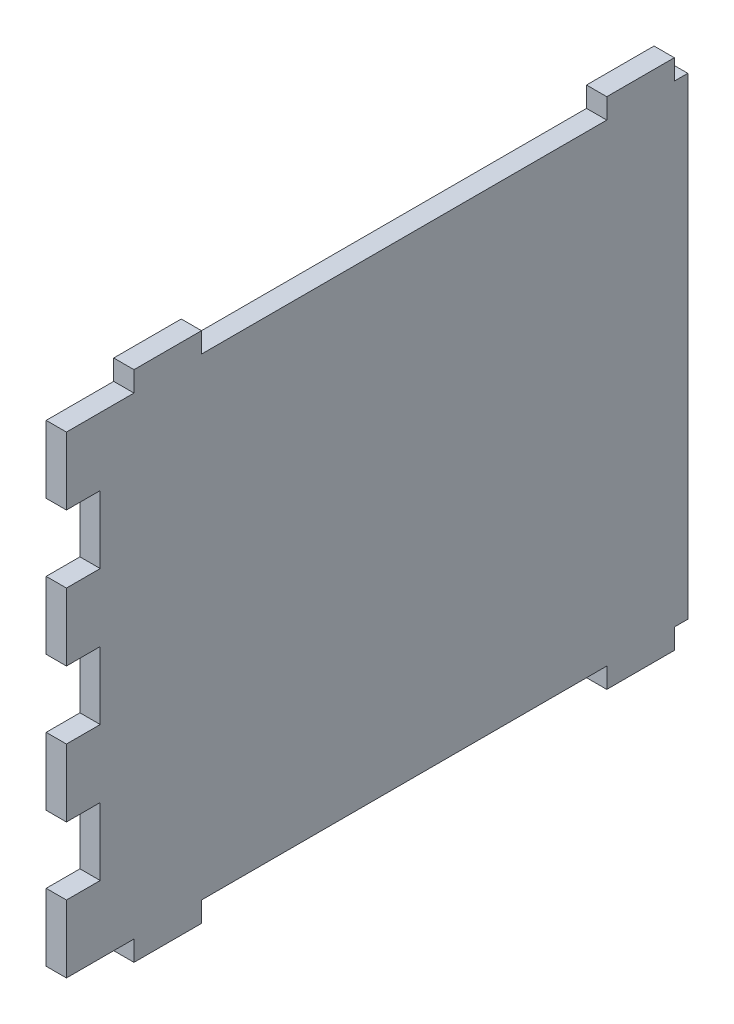
ISO-10303-21;
HEADER;
FILE_DESCRIPTION(('STEP AP214'),'2;1');
FILE_NAME('part.step','',(''),(''),'','','');
FILE_SCHEMA(('AUTOMOTIVE_DESIGN { 1 0 10303 214 1 1 1 1 }'));
ENDSEC;
DATA;
#1=APPLICATION_CONTEXT('core data for automotive mechanical design processes');
#2=APPLICATION_PROTOCOL_DEFINITION('international standard','automotive_design',2000,#1);
#3=PRODUCT_CONTEXT('',#1,'mechanical');
#4=PRODUCT('Part','Part','',(#3));
#5=PRODUCT_RELATED_PRODUCT_CATEGORY('part','',(#4));
#6=PRODUCT_DEFINITION_FORMATION('','',#4);
#7=PRODUCT_DEFINITION_CONTEXT('part definition',#1,'design');
#8=PRODUCT_DEFINITION('design','',#6,#7);
#9=PRODUCT_DEFINITION_SHAPE('','',#8);
#10=(LENGTH_UNIT() NAMED_UNIT(*) SI_UNIT(.MILLI.,.METRE.));
#11=(NAMED_UNIT(*) PLANE_ANGLE_UNIT() SI_UNIT($,.RADIAN.));
#12=(NAMED_UNIT(*) SI_UNIT($,.STERADIAN.) SOLID_ANGLE_UNIT());
#13=UNCERTAINTY_MEASURE_WITH_UNIT(LENGTH_MEASURE(1.E-05),#10,'distance_accuracy_value','');
#14=(GEOMETRIC_REPRESENTATION_CONTEXT(3) GLOBAL_UNCERTAINTY_ASSIGNED_CONTEXT((#13)) GLOBAL_UNIT_ASSIGNED_CONTEXT((#10,
#11,#12)) REPRESENTATION_CONTEXT('',''));
#15=CARTESIAN_POINT('',(0.,0.,0.));
#16=DIRECTION('',(0.,0.,1.));
#17=DIRECTION('',(1.,0.,0.));
#18=AXIS2_PLACEMENT_3D('',#15,#16,#17);
#19=CARTESIAN_POINT('',(0.,35.,45.));
#20=DIRECTION('',(0.,0.,1.));
#21=DIRECTION('',(0.,-1.,0.));
#22=AXIS2_PLACEMENT_3D('',#19,#20,#21);
#23=PLANE('',#22);
#24=DIRECTION('',(1.,0.,0.));
#25=VECTOR('',#24,1.);
#26=CARTESIAN_POINT('',(0.,-25.,45.));
#27=LINE('',#26,#25);
#28=CARTESIAN_POINT('',(0.,-25.,45.));
#29=VERTEX_POINT('',#28);
#30=CARTESIAN_POINT('',(3.,-25.,45.));
#31=VERTEX_POINT('',#30);
#32=EDGE_CURVE('E60',#29,#31,#27,.T.);
#33=ORIENTED_EDGE('',*,*,#32,.T.);
#34=DIRECTION('',(0.,-1.,0.));
#35=VECTOR('',#34,1.);
#36=CARTESIAN_POINT('',(3.,35.,45.));
#37=LINE('',#36,#35);
#38=CARTESIAN_POINT('',(3.,-15.,45.));
#39=VERTEX_POINT('',#38);
#40=EDGE_CURVE('E402',#39,#31,#37,.T.);
#41=ORIENTED_EDGE('',*,*,#40,.F.);
#42=DIRECTION('',(1.,0.,0.));
#43=VECTOR('',#42,1.);
#44=CARTESIAN_POINT('',(0.,-15.,45.));
#45=LINE('',#44,#43);
#46=CARTESIAN_POINT('',(0.,-15.,45.));
#47=VERTEX_POINT('',#46);
#48=EDGE_CURVE('E312',#47,#39,#45,.T.);
#49=ORIENTED_EDGE('',*,*,#48,.F.);
#50=DIRECTION('',(0.,-1.,0.));
#51=VECTOR('',#50,1.);
#52=CARTESIAN_POINT('',(0.,35.,45.));
#53=LINE('',#52,#51);
#54=EDGE_CURVE('E65',#47,#29,#53,.T.);
#55=ORIENTED_EDGE('',*,*,#54,.T.);
#56=EDGE_LOOP('',(#33,#41,#49,#55));
#57=FACE_BOUND('',#56,.T.);
#58=ADVANCED_FACE('F44',(#57),#23,.T.);
#59=DIRECTION('',(1.,0.,0.));
#60=VECTOR('',#59,1.);
#61=CARTESIAN_POINT('',(0.,-5.,45.));
#62=LINE('',#61,#60);
#63=CARTESIAN_POINT('',(0.,-5.,45.));
#64=VERTEX_POINT('',#63);
#65=CARTESIAN_POINT('',(3.,-5.,45.));
#66=VERTEX_POINT('',#65);
#67=EDGE_CURVE('E301',#64,#66,#62,.T.);
#68=ORIENTED_EDGE('',*,*,#67,.T.);
#69=CARTESIAN_POINT('',(3.,5.,45.));
#70=VERTEX_POINT('',#69);
#71=EDGE_CURVE('E407',#70,#66,#37,.T.);
#72=ORIENTED_EDGE('',*,*,#71,.F.);
#73=DIRECTION('',(1.,0.,0.));
#74=VECTOR('',#73,1.);
#75=CARTESIAN_POINT('',(0.,5.,45.));
#76=LINE('',#75,#74);
#77=CARTESIAN_POINT('',(0.,5.,45.));
#78=VERTEX_POINT('',#77);
#79=EDGE_CURVE('E347',#78,#70,#76,.T.);
#80=ORIENTED_EDGE('',*,*,#79,.F.);
#81=EDGE_CURVE('E396',#78,#64,#53,.T.);
#82=ORIENTED_EDGE('',*,*,#81,.T.);
#83=EDGE_LOOP('',(#68,#72,#80,#82));
#84=FACE_BOUND('',#83,.T.);
#85=ADVANCED_FACE('F628',(#84),#23,.T.);
#86=CARTESIAN_POINT('',(3.,0.,40.));
#87=DIRECTION('',(0.,0.,1.));
#88=DIRECTION('',(1.,0.,0.));
#89=AXIS2_PLACEMENT_3D('',#86,#87,#88);
#90=PLANE('',#89);
#91=DIRECTION('',(0.,1.,0.));
#92=VECTOR('',#91,1.);
#93=CARTESIAN_POINT('',(0.,0.,40.));
#94=LINE('',#93,#92);
#95=CARTESIAN_POINT('',(0.,35.,40.));
#96=VERTEX_POINT('',#95);
#97=CARTESIAN_POINT('',(0.,38.,40.));
#98=VERTEX_POINT('',#97);
#99=EDGE_CURVE('E444',#96,#98,#94,.T.);
#100=ORIENTED_EDGE('',*,*,#99,.F.);
#101=DIRECTION('',(1.,0.,0.));
#102=VECTOR('',#101,1.);
#103=CARTESIAN_POINT('',(0.,35.,40.));
#104=LINE('',#103,#102);
#105=CARTESIAN_POINT('',(3.,35.,40.));
#106=VERTEX_POINT('',#105);
#107=EDGE_CURVE('E399',#96,#106,#104,.T.);
#108=ORIENTED_EDGE('',*,*,#107,.T.);
#109=DIRECTION('',(0.,1.,0.));
#110=VECTOR('',#109,1.);
#111=CARTESIAN_POINT('',(3.,0.,40.));
#112=LINE('',#111,#110);
#113=CARTESIAN_POINT('',(3.,38.,40.));
#114=VERTEX_POINT('',#113);
#115=EDGE_CURVE('E459',#106,#114,#112,.T.);
#116=ORIENTED_EDGE('',*,*,#115,.T.);
#117=DIRECTION('',(-1.,0.,0.));
#118=VECTOR('',#117,1.);
#119=CARTESIAN_POINT('',(3.,38.,40.));
#120=LINE('',#119,#118);
#121=EDGE_CURVE('E499',#114,#98,#120,.T.);
#122=ORIENTED_EDGE('',*,*,#121,.T.);
#123=EDGE_LOOP('',(#100,#108,#116,#122));
#124=FACE_BOUND('',#123,.T.);
#125=ADVANCED_FACE('F634',(#124),#90,.T.);
#126=CARTESIAN_POINT('',(3.,0.,-40.));
#127=DIRECTION('',(0.,0.,1.));
#128=DIRECTION('',(1.,0.,0.));
#129=AXIS2_PLACEMENT_3D('',#126,#127,#128);
#130=PLANE('',#129);
#131=DIRECTION('',(1.,0.,0.));
#132=VECTOR('',#131,1.);
#133=CARTESIAN_POINT('',(0.,35.,-40.));
#134=LINE('',#133,#132);
#135=CARTESIAN_POINT('',(0.,35.,-40.));
#136=VERTEX_POINT('',#135);
#137=CARTESIAN_POINT('',(3.,35.,-40.));
#138=VERTEX_POINT('',#137);
#139=EDGE_CURVE('E441',#136,#138,#134,.T.);
#140=ORIENTED_EDGE('',*,*,#139,.F.);
#141=DIRECTION('',(0.,1.,0.));
#142=VECTOR('',#141,1.);
#143=CARTESIAN_POINT('',(0.,0.,-40.));
#144=LINE('',#143,#142);
#145=CARTESIAN_POINT('',(0.,38.,-40.));
#146=VERTEX_POINT('',#145);
#147=EDGE_CURVE('E522',#136,#146,#144,.T.);
#148=ORIENTED_EDGE('',*,*,#147,.T.);
#149=DIRECTION('',(-1.,0.,0.));
#150=VECTOR('',#149,1.);
#151=CARTESIAN_POINT('',(3.,38.,-40.));
#152=LINE('',#151,#150);
#153=CARTESIAN_POINT('',(3.,38.,-40.));
#154=VERTEX_POINT('',#153);
#155=EDGE_CURVE('E562',#154,#146,#152,.T.);
#156=ORIENTED_EDGE('',*,*,#155,.F.);
#157=DIRECTION('',(0.,1.,0.));
#158=VECTOR('',#157,1.);
#159=CARTESIAN_POINT('',(3.,0.,-40.));
#160=LINE('',#159,#158);
#161=EDGE_CURVE('E476',#138,#154,#160,.T.);
#162=ORIENTED_EDGE('',*,*,#161,.F.);
#163=EDGE_LOOP('',(#140,#148,#156,#162));
#164=FACE_BOUND('',#163,.T.);
#165=ADVANCED_FACE('F678',(#164),#130,.F.);
#166=DIRECTION('',(1.,0.,0.));
#167=VECTOR('',#166,1.);
#168=CARTESIAN_POINT('',(0.,-35.,40.));
#169=LINE('',#168,#167);
#170=CARTESIAN_POINT('',(0.,-35.,40.));
#171=VERTEX_POINT('',#170);
#172=CARTESIAN_POINT('',(3.,-35.,40.));
#173=VERTEX_POINT('',#172);
#174=EDGE_CURVE('E411',#171,#173,#169,.T.);
#175=ORIENTED_EDGE('',*,*,#174,.F.);
#176=CARTESIAN_POINT('',(0.,-38.,40.));
#177=VERTEX_POINT('',#176);
#178=EDGE_CURVE('E500',#177,#171,#94,.T.);
#179=ORIENTED_EDGE('',*,*,#178,.F.);
#180=DIRECTION('',(-1.,0.,0.));
#181=VECTOR('',#180,1.);
#182=CARTESIAN_POINT('',(3.,-38.,40.));
#183=LINE('',#182,#181);
#184=CARTESIAN_POINT('',(3.,-38.,40.));
#185=VERTEX_POINT('',#184);
#186=EDGE_CURVE('E11',#185,#177,#183,.T.);
#187=ORIENTED_EDGE('',*,*,#186,.F.);
#188=EDGE_CURVE('E454',#185,#173,#112,.T.);
#189=ORIENTED_EDGE('',*,*,#188,.T.);
#190=EDGE_LOOP('',(#175,#179,#187,#189));
#191=FACE_BOUND('',#190,.T.);
#192=ADVANCED_FACE('F46',(#191),#90,.T.);
#193=CARTESIAN_POINT('',(3.,-38.,0.));
#194=DIRECTION('',(0.,1.,0.));
#195=DIRECTION('',(0.,0.,1.));
#196=AXIS2_PLACEMENT_3D('',#193,#194,#195);
#197=PLANE('',#196);
#198=DIRECTION('',(0.,0.,-1.));
#199=VECTOR('',#198,1.);
#200=CARTESIAN_POINT('',(0.,-38.,0.));
#201=LINE('',#200,#199);
#202=CARTESIAN_POINT('',(0.,-38.,30.));
#203=VERTEX_POINT('',#202);
#204=EDGE_CURVE('E503',#177,#203,#201,.T.);
#205=ORIENTED_EDGE('',*,*,#204,.T.);
#206=DIRECTION('',(-1.,0.,0.));
#207=VECTOR('',#206,1.);
#208=CARTESIAN_POINT('',(3.,-38.,30.));
#209=LINE('',#208,#207);
#210=CARTESIAN_POINT('',(3.,-38.,30.));
#211=VERTEX_POINT('',#210);
#212=EDGE_CURVE('E53',#211,#203,#209,.T.);
#213=ORIENTED_EDGE('',*,*,#212,.F.);
#214=DIRECTION('',(0.,0.,-1.));
#215=VECTOR('',#214,1.);
#216=CARTESIAN_POINT('',(3.,-38.,0.));
#217=LINE('',#216,#215);
#218=EDGE_CURVE('E458',#185,#211,#217,.T.);
#219=ORIENTED_EDGE('',*,*,#218,.F.);
#220=ORIENTED_EDGE('',*,*,#186,.T.);
#221=EDGE_LOOP('',(#205,#213,#219,#220));
#222=FACE_BOUND('',#221,.T.);
#223=ADVANCED_FACE('F587',(#222),#197,.F.);
#224=CARTESIAN_POINT('',(3.,0.,29.9999999999999));
#225=DIRECTION('',(0.,0.,-1.));
#226=DIRECTION('',(0.,1.,0.));
#227=AXIS2_PLACEMENT_3D('',#224,#225,#226);
#228=PLANE('',#227);
#229=DIRECTION('',(0.,-1.,0.));
#230=VECTOR('',#229,1.);
#231=CARTESIAN_POINT('',(0.,0.,29.9999999999999));
#232=LINE('',#231,#230);
#233=CARTESIAN_POINT('',(0.,-35.,30.));
#234=VERTEX_POINT('',#233);
#235=EDGE_CURVE('E507',#234,#203,#232,.T.);
#236=ORIENTED_EDGE('',*,*,#235,.F.);
#237=DIRECTION('',(-1.,0.,0.));
#238=VECTOR('',#237,1.);
#239=CARTESIAN_POINT('',(3.,-35.,30.));
#240=LINE('',#239,#238);
#241=CARTESIAN_POINT('',(3.,-35.,30.));
#242=VERTEX_POINT('',#241);
#243=EDGE_CURVE('E576',#242,#234,#240,.T.);
#244=ORIENTED_EDGE('',*,*,#243,.F.);
#245=DIRECTION('',(0.,-1.,0.));
#246=VECTOR('',#245,1.);
#247=CARTESIAN_POINT('',(3.,0.,29.9999999999999));
#248=LINE('',#247,#246);
#249=EDGE_CURVE('E462',#242,#211,#248,.T.);
#250=ORIENTED_EDGE('',*,*,#249,.T.);
#251=ORIENTED_EDGE('',*,*,#212,.T.);
#252=EDGE_LOOP('',(#236,#244,#250,#251));
#253=FACE_BOUND('',#252,.T.);
#254=ADVANCED_FACE('F582',(#253),#228,.T.);
#255=CARTESIAN_POINT('',(3.,-35.,0.));
#256=DIRECTION('',(0.,1.,0.));
#257=DIRECTION('',(0.,0.,1.));
#258=AXIS2_PLACEMENT_3D('',#255,#256,#257);
#259=PLANE('',#258);
#260=DIRECTION('',(0.,0.,-1.));
#261=VECTOR('',#260,1.);
#262=CARTESIAN_POINT('',(0.,-35.,0.));
#263=LINE('',#262,#261);
#264=CARTESIAN_POINT('',(0.,-35.,-30.));
#265=VERTEX_POINT('',#264);
#266=EDGE_CURVE('E511',#234,#265,#263,.T.);
#267=ORIENTED_EDGE('',*,*,#266,.T.);
#268=DIRECTION('',(-1.,0.,0.));
#269=VECTOR('',#268,1.);
#270=CARTESIAN_POINT('',(3.,-35.,-30.));
#271=LINE('',#270,#269);
#272=CARTESIAN_POINT('',(3.,-35.,-30.));
#273=VERTEX_POINT('',#272);
#274=EDGE_CURVE('E572',#273,#265,#271,.T.);
#275=ORIENTED_EDGE('',*,*,#274,.F.);
#276=DIRECTION('',(0.,0.,-1.));
#277=VECTOR('',#276,1.);
#278=CARTESIAN_POINT('',(3.,-35.,0.));
#279=LINE('',#278,#277);
#280=EDGE_CURVE('E466',#242,#273,#279,.T.);
#281=ORIENTED_EDGE('',*,*,#280,.F.);
#282=ORIENTED_EDGE('',*,*,#243,.T.);
#283=EDGE_LOOP('',(#267,#275,#281,#282));
#284=FACE_BOUND('',#283,.T.);
#285=ADVANCED_FACE('F593',(#284),#259,.F.);
#286=CARTESIAN_POINT('',(3.,0.,-30.));
#287=DIRECTION('',(0.,0.,-1.));
#288=DIRECTION('',(-1.,0.,0.));
#289=AXIS2_PLACEMENT_3D('',#286,#287,#288);
#290=PLANE('',#289);
#291=DIRECTION('',(0.,-1.,0.));
#292=VECTOR('',#291,1.);
#293=CARTESIAN_POINT('',(0.,0.,-30.));
#294=LINE('',#293,#292);
#295=CARTESIAN_POINT('',(0.,-38.,-30.));
#296=VERTEX_POINT('',#295);
#297=EDGE_CURVE('E514',#265,#296,#294,.T.);
#298=ORIENTED_EDGE('',*,*,#297,.T.);
#299=DIRECTION('',(-1.,0.,0.));
#300=VECTOR('',#299,1.);
#301=CARTESIAN_POINT('',(3.,-38.,-30.));
#302=LINE('',#301,#300);
#303=CARTESIAN_POINT('',(3.,-38.,-30.));
#304=VERTEX_POINT('',#303);
#305=EDGE_CURVE('E569',#304,#296,#302,.T.);
#306=ORIENTED_EDGE('',*,*,#305,.F.);
#307=DIRECTION('',(0.,-1.,0.));
#308=VECTOR('',#307,1.);
#309=CARTESIAN_POINT('',(3.,0.,-30.));
#310=LINE('',#309,#308);
#311=EDGE_CURVE('E469',#273,#304,#310,.T.);
#312=ORIENTED_EDGE('',*,*,#311,.F.);
#313=ORIENTED_EDGE('',*,*,#274,.T.);
#314=EDGE_LOOP('',(#298,#306,#312,#313));
#315=FACE_BOUND('',#314,.T.);
#316=ADVANCED_FACE('F597',(#315),#290,.F.);
#317=CARTESIAN_POINT('',(3.,-38.,0.));
#318=DIRECTION('',(0.,-1.,0.));
#319=DIRECTION('',(0.,0.,-1.));
#320=AXIS2_PLACEMENT_3D('',#317,#318,#319);
#321=PLANE('',#320);
#322=DIRECTION('',(0.,0.,1.));
#323=VECTOR('',#322,1.);
#324=CARTESIAN_POINT('',(0.,-38.,0.));
#325=LINE('',#324,#323);
#326=CARTESIAN_POINT('',(0.,-38.,-40.));
#327=VERTEX_POINT('',#326);
#328=EDGE_CURVE('E518',#327,#296,#325,.T.);
#329=ORIENTED_EDGE('',*,*,#328,.F.);
#330=DIRECTION('',(-1.,0.,0.));
#331=VECTOR('',#330,1.);
#332=CARTESIAN_POINT('',(3.,-38.,-40.));
#333=LINE('',#332,#331);
#334=CARTESIAN_POINT('',(3.,-38.,-40.));
#335=VERTEX_POINT('',#334);
#336=EDGE_CURVE('E566',#335,#327,#333,.T.);
#337=ORIENTED_EDGE('',*,*,#336,.F.);
#338=DIRECTION('',(0.,0.,1.));
#339=VECTOR('',#338,1.);
#340=CARTESIAN_POINT('',(3.,-38.,0.));
#341=LINE('',#340,#339);
#342=EDGE_CURVE('E472',#335,#304,#341,.T.);
#343=ORIENTED_EDGE('',*,*,#342,.T.);
#344=ORIENTED_EDGE('',*,*,#305,.T.);
#345=EDGE_LOOP('',(#329,#337,#343,#344));
#346=FACE_BOUND('',#345,.T.);
#347=ADVANCED_FACE('F889',(#346),#321,.T.);
#348=CARTESIAN_POINT('',(0.,-35.,-40.));
#349=VERTEX_POINT('',#348);
#350=EDGE_CURVE('E523',#327,#349,#144,.T.);
#351=ORIENTED_EDGE('',*,*,#350,.T.);
#352=DIRECTION('',(1.,0.,0.));
#353=VECTOR('',#352,1.);
#354=CARTESIAN_POINT('',(0.,-35.,-40.));
#355=LINE('',#354,#353);
#356=CARTESIAN_POINT('',(3.,-35.,-40.));
#357=VERTEX_POINT('',#356);
#358=EDGE_CURVE('E430',#349,#357,#355,.T.);
#359=ORIENTED_EDGE('',*,*,#358,.T.);
#360=EDGE_CURVE('E477',#335,#357,#160,.T.);
#361=ORIENTED_EDGE('',*,*,#360,.F.);
#362=ORIENTED_EDGE('',*,*,#336,.T.);
#363=EDGE_LOOP('',(#351,#359,#361,#362));
#364=FACE_BOUND('',#363,.T.);
#365=ADVANCED_FACE('F884',(#364),#130,.F.);
#366=CARTESIAN_POINT('',(3.,38.,0.));
#367=DIRECTION('',(0.,-1.,0.));
#368=DIRECTION('',(0.,0.,-1.));
#369=AXIS2_PLACEMENT_3D('',#366,#367,#368);
#370=PLANE('',#369);
#371=DIRECTION('',(0.,0.,1.));
#372=VECTOR('',#371,1.);
#373=CARTESIAN_POINT('',(0.,38.,0.));
#374=LINE('',#373,#372);
#375=CARTESIAN_POINT('',(0.,38.,-30.));
#376=VERTEX_POINT('',#375);
#377=EDGE_CURVE('E527',#146,#376,#374,.T.);
#378=ORIENTED_EDGE('',*,*,#377,.T.);
#379=DIRECTION('',(-1.,0.,0.));
#380=VECTOR('',#379,1.);
#381=CARTESIAN_POINT('',(3.,38.,-30.));
#382=LINE('',#381,#380);
#383=CARTESIAN_POINT('',(3.,38.,-30.));
#384=VERTEX_POINT('',#383);
#385=EDGE_CURVE('E559',#384,#376,#382,.T.);
#386=ORIENTED_EDGE('',*,*,#385,.F.);
#387=DIRECTION('',(0.,0.,1.));
#388=VECTOR('',#387,1.);
#389=CARTESIAN_POINT('',(3.,38.,0.));
#390=LINE('',#389,#388);
#391=EDGE_CURVE('E481',#154,#384,#390,.T.);
#392=ORIENTED_EDGE('',*,*,#391,.F.);
#393=ORIENTED_EDGE('',*,*,#155,.T.);
#394=EDGE_LOOP('',(#378,#386,#392,#393));
#395=FACE_BOUND('',#394,.T.);
#396=ADVANCED_FACE('F682',(#395),#370,.F.);
#397=CARTESIAN_POINT('',(3.,0.,-30.));
#398=DIRECTION('',(0.,0.,1.));
#399=DIRECTION('',(1.,0.,0.));
#400=AXIS2_PLACEMENT_3D('',#397,#398,#399);
#401=PLANE('',#400);
#402=DIRECTION('',(0.,1.,0.));
#403=VECTOR('',#402,1.);
#404=CARTESIAN_POINT('',(0.,0.,-30.));
#405=LINE('',#404,#403);
#406=CARTESIAN_POINT('',(0.,35.,-30.));
#407=VERTEX_POINT('',#406);
#408=EDGE_CURVE('E531',#407,#376,#405,.T.);
#409=ORIENTED_EDGE('',*,*,#408,.F.);
#410=DIRECTION('',(-1.,0.,0.));
#411=VECTOR('',#410,1.);
#412=CARTESIAN_POINT('',(3.,35.,-30.));
#413=LINE('',#412,#411);
#414=CARTESIAN_POINT('',(3.,35.,-30.));
#415=VERTEX_POINT('',#414);
#416=EDGE_CURVE('E556',#415,#407,#413,.T.);
#417=ORIENTED_EDGE('',*,*,#416,.F.);
#418=DIRECTION('',(0.,1.,0.));
#419=VECTOR('',#418,1.);
#420=CARTESIAN_POINT('',(3.,0.,-30.));
#421=LINE('',#420,#419);
#422=EDGE_CURVE('E484',#415,#384,#421,.T.);
#423=ORIENTED_EDGE('',*,*,#422,.T.);
#424=ORIENTED_EDGE('',*,*,#385,.T.);
#425=EDGE_LOOP('',(#409,#417,#423,#424));
#426=FACE_BOUND('',#425,.T.);
#427=ADVANCED_FACE('F685',(#426),#401,.T.);
#428=CARTESIAN_POINT('',(3.,35.,0.));
#429=DIRECTION('',(0.,1.,0.));
#430=DIRECTION('',(0.,0.,1.));
#431=AXIS2_PLACEMENT_3D('',#428,#429,#430);
#432=PLANE('',#431);
#433=DIRECTION('',(0.,0.,-1.));
#434=VECTOR('',#433,1.);
#435=CARTESIAN_POINT('',(0.,35.,0.));
#436=LINE('',#435,#434);
#437=CARTESIAN_POINT('',(0.,35.,30.));
#438=VERTEX_POINT('',#437);
#439=EDGE_CURVE('E535',#438,#407,#436,.T.);
#440=ORIENTED_EDGE('',*,*,#439,.F.);
#441=DIRECTION('',(-1.,0.,0.));
#442=VECTOR('',#441,1.);
#443=CARTESIAN_POINT('',(3.,35.,30.));
#444=LINE('',#443,#442);
#445=CARTESIAN_POINT('',(3.,35.,30.));
#446=VERTEX_POINT('',#445);
#447=EDGE_CURVE('E553',#446,#438,#444,.T.);
#448=ORIENTED_EDGE('',*,*,#447,.F.);
#449=DIRECTION('',(0.,0.,-1.));
#450=VECTOR('',#449,1.);
#451=CARTESIAN_POINT('',(3.,35.,0.));
#452=LINE('',#451,#450);
#453=EDGE_CURVE('E488',#446,#415,#452,.T.);
#454=ORIENTED_EDGE('',*,*,#453,.T.);
#455=ORIENTED_EDGE('',*,*,#416,.T.);
#456=EDGE_LOOP('',(#440,#448,#454,#455));
#457=FACE_BOUND('',#456,.T.);
#458=ADVANCED_FACE('F689',(#457),#432,.T.);
#459=CARTESIAN_POINT('',(3.,0.,30.));
#460=DIRECTION('',(0.,0.,1.));
#461=DIRECTION('',(1.,0.,0.));
#462=AXIS2_PLACEMENT_3D('',#459,#460,#461);
#463=PLANE('',#462);
#464=DIRECTION('',(0.,1.,0.));
#465=VECTOR('',#464,1.);
#466=CARTESIAN_POINT('',(0.,0.,30.));
#467=LINE('',#466,#465);
#468=CARTESIAN_POINT('',(0.,38.,30.));
#469=VERTEX_POINT('',#468);
#470=EDGE_CURVE('E539',#438,#469,#467,.T.);
#471=ORIENTED_EDGE('',*,*,#470,.T.);
#472=DIRECTION('',(-1.,0.,0.));
#473=VECTOR('',#472,1.);
#474=CARTESIAN_POINT('',(3.,38.,30.));
#475=LINE('',#474,#473);
#476=CARTESIAN_POINT('',(3.,38.,30.));
#477=VERTEX_POINT('',#476);
#478=EDGE_CURVE('E550',#477,#469,#475,.T.);
#479=ORIENTED_EDGE('',*,*,#478,.F.);
#480=DIRECTION('',(0.,1.,0.));
#481=VECTOR('',#480,1.);
#482=CARTESIAN_POINT('',(3.,0.,30.));
#483=LINE('',#482,#481);
#484=EDGE_CURVE('E492',#446,#477,#483,.T.);
#485=ORIENTED_EDGE('',*,*,#484,.F.);
#486=ORIENTED_EDGE('',*,*,#447,.T.);
#487=EDGE_LOOP('',(#471,#479,#485,#486));
#488=FACE_BOUND('',#487,.T.);
#489=ADVANCED_FACE('F694',(#488),#463,.F.);
#490=CARTESIAN_POINT('',(3.,38.,0.));
#491=DIRECTION('',(0.,1.,0.));
#492=DIRECTION('',(0.,0.,1.));
#493=AXIS2_PLACEMENT_3D('',#490,#491,#492);
#494=PLANE('',#493);
#495=DIRECTION('',(0.,0.,-1.));
#496=VECTOR('',#495,1.);
#497=CARTESIAN_POINT('',(0.,38.,0.));
#498=LINE('',#497,#496);
#499=EDGE_CURVE('E543',#98,#469,#498,.T.);
#500=ORIENTED_EDGE('',*,*,#499,.F.);
#501=ORIENTED_EDGE('',*,*,#121,.F.);
#502=DIRECTION('',(0.,0.,-1.));
#503=VECTOR('',#502,1.);
#504=CARTESIAN_POINT('',(3.,38.,0.));
#505=LINE('',#504,#503);
#506=EDGE_CURVE('E495',#114,#477,#505,.T.);
#507=ORIENTED_EDGE('',*,*,#506,.T.);
#508=ORIENTED_EDGE('',*,*,#478,.T.);
#509=EDGE_LOOP('',(#500,#501,#507,#508));
#510=FACE_BOUND('',#509,.T.);
#511=ADVANCED_FACE('F700',(#510),#494,.T.);
#512=CARTESIAN_POINT('',(3.,0.,0.));
#513=DIRECTION('',(1.,0.,0.));
#514=DIRECTION('',(0.,0.,-1.));
#515=AXIS2_PLACEMENT_3D('',#512,#513,#514);
#516=PLANE('',#515);
#517=ORIENTED_EDGE('',*,*,#188,.F.);
#518=ORIENTED_EDGE('',*,*,#218,.T.);
#519=ORIENTED_EDGE('',*,*,#249,.F.);
#520=ORIENTED_EDGE('',*,*,#280,.T.);
#521=ORIENTED_EDGE('',*,*,#311,.T.);
#522=ORIENTED_EDGE('',*,*,#342,.F.);
#523=ORIENTED_EDGE('',*,*,#360,.T.);
#524=DIRECTION('',(0.,0.,-1.));
#525=VECTOR('',#524,1.);
#526=CARTESIAN_POINT('',(3.,-35.,-40.));
#527=LINE('',#526,#525);
#528=CARTESIAN_POINT('',(3.,-35.,-42.));
#529=VERTEX_POINT('',#528);
#530=EDGE_CURVE('E414',#357,#529,#527,.T.);
#531=ORIENTED_EDGE('',*,*,#530,.T.);
#532=DIRECTION('',(0.,1.,0.));
#533=VECTOR('',#532,1.);
#534=CARTESIAN_POINT('',(3.,35.,-42.));
#535=LINE('',#534,#533);
#536=CARTESIAN_POINT('',(3.,35.,-42.));
#537=VERTEX_POINT('',#536);
#538=EDGE_CURVE('E434',#529,#537,#535,.T.);
#539=ORIENTED_EDGE('',*,*,#538,.T.);
#540=DIRECTION('',(0.,0.,1.));
#541=VECTOR('',#540,1.);
#542=CARTESIAN_POINT('',(3.,35.,-40.));
#543=LINE('',#542,#541);
#544=EDGE_CURVE('E423',#537,#138,#543,.T.);
#545=ORIENTED_EDGE('',*,*,#544,.T.);
#546=ORIENTED_EDGE('',*,*,#161,.T.);
#547=ORIENTED_EDGE('',*,*,#391,.T.);
#548=ORIENTED_EDGE('',*,*,#422,.F.);
#549=ORIENTED_EDGE('',*,*,#453,.F.);
#550=ORIENTED_EDGE('',*,*,#484,.T.);
#551=ORIENTED_EDGE('',*,*,#506,.F.);
#552=ORIENTED_EDGE('',*,*,#115,.F.);
#553=DIRECTION('',(0.,0.,1.));
#554=VECTOR('',#553,1.);
#555=CARTESIAN_POINT('',(3.,35.,40.));
#556=LINE('',#555,#554);
#557=CARTESIAN_POINT('',(3.,35.,50.));
#558=VERTEX_POINT('',#557);
#559=EDGE_CURVE('E381',#106,#558,#556,.T.);
#560=ORIENTED_EDGE('',*,*,#559,.T.);
#561=DIRECTION('',(0.,-1.,0.));
#562=VECTOR('',#561,1.);
#563=CARTESIAN_POINT('',(3.,35.,50.));
#564=LINE('',#563,#562);
#565=CARTESIAN_POINT('',(3.,25.,50.));
#566=VERTEX_POINT('',#565);
#567=EDGE_CURVE('E351',#558,#566,#564,.T.);
#568=ORIENTED_EDGE('',*,*,#567,.T.);
#569=DIRECTION('',(0.,0.,-1.));
#570=VECTOR('',#569,1.);
#571=CARTESIAN_POINT('',(3.,25.,45.));
#572=LINE('',#571,#570);
#573=CARTESIAN_POINT('',(3.,25.,45.));
#574=VERTEX_POINT('',#573);
#575=EDGE_CURVE('E366',#566,#574,#572,.T.);
#576=ORIENTED_EDGE('',*,*,#575,.T.);
#577=CARTESIAN_POINT('',(3.,15.,45.));
#578=VERTEX_POINT('',#577);
#579=EDGE_CURVE('E403',#574,#578,#37,.T.);
#580=ORIENTED_EDGE('',*,*,#579,.T.);
#581=DIRECTION('',(0.,0.,1.));
#582=VECTOR('',#581,1.);
#583=CARTESIAN_POINT('',(3.,15.,45.));
#584=LINE('',#583,#582);
#585=CARTESIAN_POINT('',(3.,15.,50.));
#586=VERTEX_POINT('',#585);
#587=EDGE_CURVE('E316',#578,#586,#584,.T.);
#588=ORIENTED_EDGE('',*,*,#587,.T.);
#589=DIRECTION('',(0.,-1.,0.));
#590=VECTOR('',#589,1.);
#591=CARTESIAN_POINT('',(3.,15.,50.));
#592=LINE('',#591,#590);
#593=CARTESIAN_POINT('',(3.,5.,50.));
#594=VERTEX_POINT('',#593);
#595=EDGE_CURVE('E341',#586,#594,#592,.T.);
#596=ORIENTED_EDGE('',*,*,#595,.T.);
#597=DIRECTION('',(0.,0.,-1.));
#598=VECTOR('',#597,1.);
#599=CARTESIAN_POINT('',(3.,5.,45.));
#600=LINE('',#599,#598);
#601=EDGE_CURVE('E330',#594,#70,#600,.T.);
#602=ORIENTED_EDGE('',*,*,#601,.T.);
#603=ORIENTED_EDGE('',*,*,#71,.T.);
#604=DIRECTION('',(0.,0.,1.));
#605=VECTOR('',#604,1.);
#606=CARTESIAN_POINT('',(3.,-5.,45.));
#607=LINE('',#606,#605);
#608=CARTESIAN_POINT('',(3.,-5.,50.));
#609=VERTEX_POINT('',#608);
#610=EDGE_CURVE('E284',#66,#609,#607,.T.);
#611=ORIENTED_EDGE('',*,*,#610,.T.);
#612=DIRECTION('',(0.,-1.,0.));
#613=VECTOR('',#612,1.);
#614=CARTESIAN_POINT('',(3.,-5.,50.));
#615=LINE('',#614,#613);
#616=CARTESIAN_POINT('',(3.,-15.,50.));
#617=VERTEX_POINT('',#616);
#618=EDGE_CURVE('E305',#609,#617,#615,.T.);
#619=ORIENTED_EDGE('',*,*,#618,.T.);
#620=DIRECTION('',(0.,0.,-1.));
#621=VECTOR('',#620,1.);
#622=CARTESIAN_POINT('',(3.,-15.,45.));
#623=LINE('',#622,#621);
#624=EDGE_CURVE('E293',#617,#39,#623,.T.);
#625=ORIENTED_EDGE('',*,*,#624,.T.);
#626=ORIENTED_EDGE('',*,*,#40,.T.);
#627=DIRECTION('',(0.,0.,1.));
#628=VECTOR('',#627,1.);
#629=CARTESIAN_POINT('',(3.,-25.,45.));
#630=LINE('',#629,#628);
#631=CARTESIAN_POINT('',(3.,-25.,50.));
#632=VERTEX_POINT('',#631);
#633=EDGE_CURVE('E278',#31,#632,#630,.T.);
#634=ORIENTED_EDGE('',*,*,#633,.T.);
#635=DIRECTION('',(0.,-1.,0.));
#636=VECTOR('',#635,1.);
#637=CARTESIAN_POINT('',(3.,-25.,50.));
#638=LINE('',#637,#636);
#639=CARTESIAN_POINT('',(3.,-35.,50.));
#640=VERTEX_POINT('',#639);
#641=EDGE_CURVE('E257',#632,#640,#638,.T.);
#642=ORIENTED_EDGE('',*,*,#641,.T.);
#643=DIRECTION('',(0.,0.,-1.));
#644=VECTOR('',#643,1.);
#645=CARTESIAN_POINT('',(3.,-35.,40.));
#646=LINE('',#645,#644);
#647=EDGE_CURVE('E391',#640,#173,#646,.T.);
#648=ORIENTED_EDGE('',*,*,#647,.T.);
#649=EDGE_LOOP('',(#517,#518,#519,#520,#521,#522,#523,#531,#539,#545,#546,#547,#548,#549,#550,
#551,#552,#560,#568,#576,#580,#588,#596,#602,#603,#611,#619,#625,#626,#634,#642,#648));
#650=FACE_BOUND('',#649,.T.);
#651=ADVANCED_FACE('F602',(#650),#516,.T.);
#652=CARTESIAN_POINT('',(0.,0.,0.));
#653=DIRECTION('',(1.,0.,0.));
#654=DIRECTION('',(0.,0.,-1.));
#655=AXIS2_PLACEMENT_3D('',#652,#653,#654);
#656=PLANE('',#655);
#657=ORIENTED_EDGE('',*,*,#178,.T.);
#658=DIRECTION('',(0.,0.,-1.));
#659=VECTOR('',#658,1.);
#660=CARTESIAN_POINT('',(0.,-35.,40.));
#661=LINE('',#660,#659);
#662=CARTESIAN_POINT('',(0.,-35.,50.));
#663=VERTEX_POINT('',#662);
#664=EDGE_CURVE('E270',#663,#171,#661,.T.);
#665=ORIENTED_EDGE('',*,*,#664,.F.);
#666=DIRECTION('',(0.,-1.,0.));
#667=VECTOR('',#666,1.);
#668=CARTESIAN_POINT('',(0.,-25.,50.));
#669=LINE('',#668,#667);
#670=CARTESIAN_POINT('',(0.,-25.,50.));
#671=VERTEX_POINT('',#670);
#672=EDGE_CURVE('E255',#671,#663,#669,.T.);
#673=ORIENTED_EDGE('',*,*,#672,.F.);
#674=DIRECTION('',(0.,0.,1.));
#675=VECTOR('',#674,1.);
#676=CARTESIAN_POINT('',(0.,-25.,45.));
#677=LINE('',#676,#675);
#678=EDGE_CURVE('E269',#29,#671,#677,.T.);
#679=ORIENTED_EDGE('',*,*,#678,.F.);
#680=ORIENTED_EDGE('',*,*,#54,.F.);
#681=DIRECTION('',(0.,0.,-1.));
#682=VECTOR('',#681,1.);
#683=CARTESIAN_POINT('',(0.,-15.,45.));
#684=LINE('',#683,#682);
#685=CARTESIAN_POINT('',(0.,-15.,50.));
#686=VERTEX_POINT('',#685);
#687=EDGE_CURVE('E297',#686,#47,#684,.T.);
#688=ORIENTED_EDGE('',*,*,#687,.F.);
#689=DIRECTION('',(0.,-1.,0.));
#690=VECTOR('',#689,1.);
#691=CARTESIAN_POINT('',(0.,-5.,50.));
#692=LINE('',#691,#690);
#693=CARTESIAN_POINT('',(0.,-5.,50.));
#694=VERTEX_POINT('',#693);
#695=EDGE_CURVE('E292',#694,#686,#692,.T.);
#696=ORIENTED_EDGE('',*,*,#695,.F.);
#697=DIRECTION('',(0.,0.,1.));
#698=VECTOR('',#697,1.);
#699=CARTESIAN_POINT('',(0.,-5.,45.));
#700=LINE('',#699,#698);
#701=EDGE_CURVE('E288',#64,#694,#700,.T.);
#702=ORIENTED_EDGE('',*,*,#701,.F.);
#703=ORIENTED_EDGE('',*,*,#81,.F.);
#704=DIRECTION('',(0.,0.,-1.));
#705=VECTOR('',#704,1.);
#706=CARTESIAN_POINT('',(0.,5.,45.));
#707=LINE('',#706,#705);
#708=CARTESIAN_POINT('',(0.,5.,50.));
#709=VERTEX_POINT('',#708);
#710=EDGE_CURVE('E334',#709,#78,#707,.T.);
#711=ORIENTED_EDGE('',*,*,#710,.F.);
#712=DIRECTION('',(0.,-1.,0.));
#713=VECTOR('',#712,1.);
#714=CARTESIAN_POINT('',(0.,15.,50.));
#715=LINE('',#714,#713);
#716=CARTESIAN_POINT('',(0.,15.,50.));
#717=VERTEX_POINT('',#716);
#718=EDGE_CURVE('E329',#717,#709,#715,.T.);
#719=ORIENTED_EDGE('',*,*,#718,.F.);
#720=DIRECTION('',(0.,0.,1.));
#721=VECTOR('',#720,1.);
#722=CARTESIAN_POINT('',(0.,15.,45.));
#723=LINE('',#722,#721);
#724=CARTESIAN_POINT('',(0.,15.,45.));
#725=VERTEX_POINT('',#724);
#726=EDGE_CURVE('E325',#725,#717,#723,.T.);
#727=ORIENTED_EDGE('',*,*,#726,.F.);
#728=CARTESIAN_POINT('',(0.,25.,45.));
#729=VERTEX_POINT('',#728);
#730=EDGE_CURVE('E392',#729,#725,#53,.T.);
#731=ORIENTED_EDGE('',*,*,#730,.F.);
#732=DIRECTION('',(0.,0.,-1.));
#733=VECTOR('',#732,1.);
#734=CARTESIAN_POINT('',(0.,25.,45.));
#735=LINE('',#734,#733);
#736=CARTESIAN_POINT('',(0.,25.,50.));
#737=VERTEX_POINT('',#736);
#738=EDGE_CURVE('E365',#737,#729,#735,.T.);
#739=ORIENTED_EDGE('',*,*,#738,.F.);
#740=DIRECTION('',(0.,-1.,0.));
#741=VECTOR('',#740,1.);
#742=CARTESIAN_POINT('',(0.,35.,50.));
#743=LINE('',#742,#741);
#744=CARTESIAN_POINT('',(0.,35.,50.));
#745=VERTEX_POINT('',#744);
#746=EDGE_CURVE('E361',#745,#737,#743,.T.);
#747=ORIENTED_EDGE('',*,*,#746,.F.);
#748=DIRECTION('',(0.,0.,1.));
#749=VECTOR('',#748,1.);
#750=CARTESIAN_POINT('',(0.,35.,40.));
#751=LINE('',#750,#749);
#752=EDGE_CURVE('E388',#96,#745,#751,.T.);
#753=ORIENTED_EDGE('',*,*,#752,.F.);
#754=ORIENTED_EDGE('',*,*,#99,.T.);
#755=ORIENTED_EDGE('',*,*,#499,.T.);
#756=ORIENTED_EDGE('',*,*,#470,.F.);
#757=ORIENTED_EDGE('',*,*,#439,.T.);
#758=ORIENTED_EDGE('',*,*,#408,.T.);
#759=ORIENTED_EDGE('',*,*,#377,.F.);
#760=ORIENTED_EDGE('',*,*,#147,.F.);
#761=DIRECTION('',(0.,0.,1.));
#762=VECTOR('',#761,1.);
#763=CARTESIAN_POINT('',(0.,35.,-40.));
#764=LINE('',#763,#762);
#765=CARTESIAN_POINT('',(0.,35.,-42.));
#766=VERTEX_POINT('',#765);
#767=EDGE_CURVE('E427',#766,#136,#764,.T.);
#768=ORIENTED_EDGE('',*,*,#767,.F.);
#769=DIRECTION('',(0.,1.,0.));
#770=VECTOR('',#769,1.);
#771=CARTESIAN_POINT('',(0.,35.,-42.));
#772=LINE('',#771,#770);
#773=CARTESIAN_POINT('',(0.,-35.,-42.));
#774=VERTEX_POINT('',#773);
#775=EDGE_CURVE('E422',#774,#766,#772,.T.);
#776=ORIENTED_EDGE('',*,*,#775,.F.);
#777=DIRECTION('',(0.,0.,-1.));
#778=VECTOR('',#777,1.);
#779=CARTESIAN_POINT('',(0.,-35.,-40.));
#780=LINE('',#779,#778);
#781=EDGE_CURVE('E418',#349,#774,#780,.T.);
#782=ORIENTED_EDGE('',*,*,#781,.F.);
#783=ORIENTED_EDGE('',*,*,#350,.F.);
#784=ORIENTED_EDGE('',*,*,#328,.T.);
#785=ORIENTED_EDGE('',*,*,#297,.F.);
#786=ORIENTED_EDGE('',*,*,#266,.F.);
#787=ORIENTED_EDGE('',*,*,#235,.T.);
#788=ORIENTED_EDGE('',*,*,#204,.F.);
#789=EDGE_LOOP('',(#657,#665,#673,#679,#680,#688,#696,#702,#703,#711,#719,#727,#731,#739,#747,
#753,#754,#755,#756,#757,#758,#759,#760,#768,#776,#782,#783,#784,#785,#786,#787,#788));
#790=FACE_BOUND('',#789,.T.);
#791=ADVANCED_FACE('F268',(#790),#656,.F.);
#792=CARTESIAN_POINT('',(0.,35.,-40.));
#793=DIRECTION('',(0.,1.,0.));
#794=DIRECTION('',(0.,0.,1.));
#795=AXIS2_PLACEMENT_3D('',#792,#793,#794);
#796=PLANE('',#795);
#797=ORIENTED_EDGE('',*,*,#544,.F.);
#798=DIRECTION('',(1.,0.,0.));
#799=VECTOR('',#798,1.);
#800=CARTESIAN_POINT('',(0.,35.,-42.));
#801=LINE('',#800,#799);
#802=EDGE_CURVE('E445',#766,#537,#801,.T.);
#803=ORIENTED_EDGE('',*,*,#802,.F.);
#804=ORIENTED_EDGE('',*,*,#767,.T.);
#805=ORIENTED_EDGE('',*,*,#139,.T.);
#806=EDGE_LOOP('',(#797,#803,#804,#805));
#807=FACE_BOUND('',#806,.T.);
#808=ADVANCED_FACE('F806',(#807),#796,.T.);
#809=CARTESIAN_POINT('',(0.,35.,-42.));
#810=DIRECTION('',(0.,0.,-1.));
#811=DIRECTION('',(0.,1.,0.));
#812=AXIS2_PLACEMENT_3D('',#809,#810,#811);
#813=PLANE('',#812);
#814=ORIENTED_EDGE('',*,*,#538,.F.);
#815=DIRECTION('',(1.,0.,0.));
#816=VECTOR('',#815,1.);
#817=CARTESIAN_POINT('',(0.,-35.,-42.));
#818=LINE('',#817,#816);
#819=EDGE_CURVE('E448',#774,#529,#818,.T.);
#820=ORIENTED_EDGE('',*,*,#819,.F.);
#821=ORIENTED_EDGE('',*,*,#775,.T.);
#822=ORIENTED_EDGE('',*,*,#802,.T.);
#823=EDGE_LOOP('',(#814,#820,#821,#822));
#824=FACE_BOUND('',#823,.T.);
#825=ADVANCED_FACE('F859',(#824),#813,.T.);
#826=CARTESIAN_POINT('',(0.,-35.,-40.));
#827=DIRECTION('',(0.,-1.,0.));
#828=DIRECTION('',(0.,0.,-1.));
#829=AXIS2_PLACEMENT_3D('',#826,#827,#828);
#830=PLANE('',#829);
#831=ORIENTED_EDGE('',*,*,#530,.F.);
#832=ORIENTED_EDGE('',*,*,#358,.F.);
#833=ORIENTED_EDGE('',*,*,#781,.T.);
#834=ORIENTED_EDGE('',*,*,#819,.T.);
#835=EDGE_LOOP('',(#831,#832,#833,#834));
#836=FACE_BOUND('',#835,.T.);
#837=ADVANCED_FACE('F646',(#836),#830,.T.);
#838=CARTESIAN_POINT('',(0.,-35.,40.));
#839=DIRECTION('',(0.,-1.,0.));
#840=DIRECTION('',(0.,0.,-1.));
#841=AXIS2_PLACEMENT_3D('',#838,#839,#840);
#842=PLANE('',#841);
#843=ORIENTED_EDGE('',*,*,#647,.F.);
#844=DIRECTION('',(1.,0.,0.));
#845=VECTOR('',#844,1.);
#846=CARTESIAN_POINT('',(0.,-35.,50.));
#847=LINE('',#846,#845);
#848=EDGE_CURVE('E263',#663,#640,#847,.T.);
#849=ORIENTED_EDGE('',*,*,#848,.F.);
#850=ORIENTED_EDGE('',*,*,#664,.T.);
#851=ORIENTED_EDGE('',*,*,#174,.T.);
#852=EDGE_LOOP('',(#843,#849,#850,#851));
#853=FACE_BOUND('',#852,.T.);
#854=ADVANCED_FACE('F606',(#853),#842,.T.);
#855=DIRECTION('',(1.,0.,0.));
#856=VECTOR('',#855,1.);
#857=CARTESIAN_POINT('',(0.,15.,45.));
#858=LINE('',#857,#856);
#859=EDGE_CURVE('E337',#725,#578,#858,.T.);
#860=ORIENTED_EDGE('',*,*,#859,.T.);
#861=ORIENTED_EDGE('',*,*,#579,.F.);
#862=DIRECTION('',(1.,0.,0.));
#863=VECTOR('',#862,1.);
#864=CARTESIAN_POINT('',(0.,25.,45.));
#865=LINE('',#864,#863);
#866=EDGE_CURVE('E377',#729,#574,#865,.T.);
#867=ORIENTED_EDGE('',*,*,#866,.F.);
#868=ORIENTED_EDGE('',*,*,#730,.T.);
#869=EDGE_LOOP('',(#860,#861,#867,#868));
#870=FACE_BOUND('',#869,.T.);
#871=ADVANCED_FACE('F630',(#870),#23,.T.);
#872=CARTESIAN_POINT('',(0.,35.,40.));
#873=DIRECTION('',(0.,1.,0.));
#874=DIRECTION('',(0.,0.,1.));
#875=AXIS2_PLACEMENT_3D('',#872,#873,#874);
#876=PLANE('',#875);
#877=ORIENTED_EDGE('',*,*,#559,.F.);
#878=ORIENTED_EDGE('',*,*,#107,.F.);
#879=ORIENTED_EDGE('',*,*,#752,.T.);
#880=DIRECTION('',(1.,0.,0.));
#881=VECTOR('',#880,1.);
#882=CARTESIAN_POINT('',(0.,35.,50.));
#883=LINE('',#882,#881);
#884=EDGE_CURVE('E370',#745,#558,#883,.T.);
#885=ORIENTED_EDGE('',*,*,#884,.T.);
#886=EDGE_LOOP('',(#877,#878,#879,#885));
#887=FACE_BOUND('',#886,.T.);
#888=ADVANCED_FACE('F638',(#887),#876,.T.);
#889=CARTESIAN_POINT('',(0.,25.,45.));
#890=DIRECTION('',(0.,-1.,0.));
#891=DIRECTION('',(0.,0.,-1.));
#892=AXIS2_PLACEMENT_3D('',#889,#890,#891);
#893=PLANE('',#892);
#894=ORIENTED_EDGE('',*,*,#575,.F.);
#895=DIRECTION('',(1.,0.,0.));
#896=VECTOR('',#895,1.);
#897=CARTESIAN_POINT('',(0.,25.,50.));
#898=LINE('',#897,#896);
#899=EDGE_CURVE('E382',#737,#566,#898,.T.);
#900=ORIENTED_EDGE('',*,*,#899,.F.);
#901=ORIENTED_EDGE('',*,*,#738,.T.);
#902=ORIENTED_EDGE('',*,*,#866,.T.);
#903=EDGE_LOOP('',(#894,#900,#901,#902));
#904=FACE_BOUND('',#903,.T.);
#905=ADVANCED_FACE('F644',(#904),#893,.T.);
#906=CARTESIAN_POINT('',(0.,35.,50.));
#907=DIRECTION('',(0.,0.,1.));
#908=DIRECTION('',(1.,0.,0.));
#909=AXIS2_PLACEMENT_3D('',#906,#907,#908);
#910=PLANE('',#909);
#911=ORIENTED_EDGE('',*,*,#567,.F.);
#912=ORIENTED_EDGE('',*,*,#884,.F.);
#913=ORIENTED_EDGE('',*,*,#746,.T.);
#914=ORIENTED_EDGE('',*,*,#899,.T.);
#915=EDGE_LOOP('',(#911,#912,#913,#914));
#916=FACE_BOUND('',#915,.T.);
#917=ADVANCED_FACE('F706',(#916),#910,.T.);
#918=CARTESIAN_POINT('',(0.,5.,45.));
#919=DIRECTION('',(0.,-1.,0.));
#920=DIRECTION('',(0.,0.,-1.));
#921=AXIS2_PLACEMENT_3D('',#918,#919,#920);
#922=PLANE('',#921);
#923=ORIENTED_EDGE('',*,*,#601,.F.);
#924=DIRECTION('',(1.,0.,0.));
#925=VECTOR('',#924,1.);
#926=CARTESIAN_POINT('',(0.,5.,50.));
#927=LINE('',#926,#925);
#928=EDGE_CURVE('E352',#709,#594,#927,.T.);
#929=ORIENTED_EDGE('',*,*,#928,.F.);
#930=ORIENTED_EDGE('',*,*,#710,.T.);
#931=ORIENTED_EDGE('',*,*,#79,.T.);
#932=EDGE_LOOP('',(#923,#929,#930,#931));
#933=FACE_BOUND('',#932,.T.);
#934=ADVANCED_FACE('F662',(#933),#922,.T.);
#935=CARTESIAN_POINT('',(0.,15.,50.));
#936=DIRECTION('',(0.,0.,1.));
#937=DIRECTION('',(1.,0.,0.));
#938=AXIS2_PLACEMENT_3D('',#935,#936,#937);
#939=PLANE('',#938);
#940=ORIENTED_EDGE('',*,*,#595,.F.);
#941=DIRECTION('',(1.,0.,0.));
#942=VECTOR('',#941,1.);
#943=CARTESIAN_POINT('',(0.,15.,50.));
#944=LINE('',#943,#942);
#945=EDGE_CURVE('E355',#717,#586,#944,.T.);
#946=ORIENTED_EDGE('',*,*,#945,.F.);
#947=ORIENTED_EDGE('',*,*,#718,.T.);
#948=ORIENTED_EDGE('',*,*,#928,.T.);
#949=EDGE_LOOP('',(#940,#946,#947,#948));
#950=FACE_BOUND('',#949,.T.);
#951=ADVANCED_FACE('F660',(#950),#939,.T.);
#952=CARTESIAN_POINT('',(0.,15.,45.));
#953=DIRECTION('',(0.,1.,0.));
#954=DIRECTION('',(0.,0.,1.));
#955=AXIS2_PLACEMENT_3D('',#952,#953,#954);
#956=PLANE('',#955);
#957=ORIENTED_EDGE('',*,*,#587,.F.);
#958=ORIENTED_EDGE('',*,*,#859,.F.);
#959=ORIENTED_EDGE('',*,*,#726,.T.);
#960=ORIENTED_EDGE('',*,*,#945,.T.);
#961=EDGE_LOOP('',(#957,#958,#959,#960));
#962=FACE_BOUND('',#961,.T.);
#963=ADVANCED_FACE('F657',(#962),#956,.T.);
#964=CARTESIAN_POINT('',(0.,-15.,45.));
#965=DIRECTION('',(0.,-1.,0.));
#966=DIRECTION('',(0.,0.,-1.));
#967=AXIS2_PLACEMENT_3D('',#964,#965,#966);
#968=PLANE('',#967);
#969=ORIENTED_EDGE('',*,*,#624,.F.);
#970=DIRECTION('',(1.,0.,0.));
#971=VECTOR('',#970,1.);
#972=CARTESIAN_POINT('',(0.,-15.,50.));
#973=LINE('',#972,#971);
#974=EDGE_CURVE('E317',#686,#617,#973,.T.);
#975=ORIENTED_EDGE('',*,*,#974,.F.);
#976=ORIENTED_EDGE('',*,*,#687,.T.);
#977=ORIENTED_EDGE('',*,*,#48,.T.);
#978=EDGE_LOOP('',(#969,#975,#976,#977));
#979=FACE_BOUND('',#978,.T.);
#980=ADVANCED_FACE('F625',(#979),#968,.T.);
#981=CARTESIAN_POINT('',(0.,-5.,50.));
#982=DIRECTION('',(0.,0.,1.));
#983=DIRECTION('',(1.,0.,0.));
#984=AXIS2_PLACEMENT_3D('',#981,#982,#983);
#985=PLANE('',#984);
#986=ORIENTED_EDGE('',*,*,#618,.F.);
#987=DIRECTION('',(1.,0.,0.));
#988=VECTOR('',#987,1.);
#989=CARTESIAN_POINT('',(0.,-5.,50.));
#990=LINE('',#989,#988);
#991=EDGE_CURVE('E320',#694,#609,#990,.T.);
#992=ORIENTED_EDGE('',*,*,#991,.F.);
#993=ORIENTED_EDGE('',*,*,#695,.T.);
#994=ORIENTED_EDGE('',*,*,#974,.T.);
#995=EDGE_LOOP('',(#986,#992,#993,#994));
#996=FACE_BOUND('',#995,.T.);
#997=ADVANCED_FACE('F623',(#996),#985,.T.);
#998=CARTESIAN_POINT('',(0.,-5.,45.));
#999=DIRECTION('',(0.,1.,0.));
#1000=DIRECTION('',(0.,0.,1.));
#1001=AXIS2_PLACEMENT_3D('',#998,#999,#1000);
#1002=PLANE('',#1001);
#1003=ORIENTED_EDGE('',*,*,#610,.F.);
#1004=ORIENTED_EDGE('',*,*,#67,.F.);
#1005=ORIENTED_EDGE('',*,*,#701,.T.);
#1006=ORIENTED_EDGE('',*,*,#991,.T.);
#1007=EDGE_LOOP('',(#1003,#1004,#1005,#1006));
#1008=FACE_BOUND('',#1007,.T.);
#1009=ADVANCED_FACE('F618',(#1008),#1002,.T.);
#1010=CARTESIAN_POINT('',(0.,-25.,50.));
#1011=DIRECTION('',(0.,0.,1.));
#1012=DIRECTION('',(1.,0.,0.));
#1013=AXIS2_PLACEMENT_3D('',#1010,#1011,#1012);
#1014=PLANE('',#1013);
#1015=ORIENTED_EDGE('',*,*,#641,.F.);
#1016=DIRECTION('',(1.,0.,0.));
#1017=VECTOR('',#1016,1.);
#1018=CARTESIAN_POINT('',(0.,-25.,50.));
#1019=LINE('',#1018,#1017);
#1020=EDGE_CURVE('E251',#671,#632,#1019,.T.);
#1021=ORIENTED_EDGE('',*,*,#1020,.F.);
#1022=ORIENTED_EDGE('',*,*,#672,.T.);
#1023=ORIENTED_EDGE('',*,*,#848,.T.);
#1024=EDGE_LOOP('',(#1015,#1021,#1022,#1023));
#1025=FACE_BOUND('',#1024,.T.);
#1026=ADVANCED_FACE('F253',(#1025),#1014,.T.);
#1027=CARTESIAN_POINT('',(0.,-25.,45.));
#1028=DIRECTION('',(0.,1.,0.));
#1029=DIRECTION('',(0.,0.,1.));
#1030=AXIS2_PLACEMENT_3D('',#1027,#1028,#1029);
#1031=PLANE('',#1030);
#1032=ORIENTED_EDGE('',*,*,#633,.F.);
#1033=ORIENTED_EDGE('',*,*,#32,.F.);
#1034=ORIENTED_EDGE('',*,*,#678,.T.);
#1035=ORIENTED_EDGE('',*,*,#1020,.T.);
#1036=EDGE_LOOP('',(#1032,#1033,#1034,#1035));
#1037=FACE_BOUND('',#1036,.T.);
#1038=ADVANCED_FACE('F274',(#1037),#1031,.T.);
#1039=CLOSED_SHELL('',(#58,#85,#125,#165,#192,#223,#254,#285,#316,#347,#365,#396,#427,#458,#489,
#511,#651,#791,#808,#825,#837,#854,#871,#888,#905,#917,#934,#951,#963,#980,#997,#1009,#1026,#1038));
#1040=MANIFOLD_SOLID_BREP('B2',#1039);
#1041=ADVANCED_BREP_SHAPE_REPRESENTATION('',(#18,#1040),#14);
#1042=SHAPE_DEFINITION_REPRESENTATION(#9,#1041);
ENDSEC;
END-ISO-10303-21;
